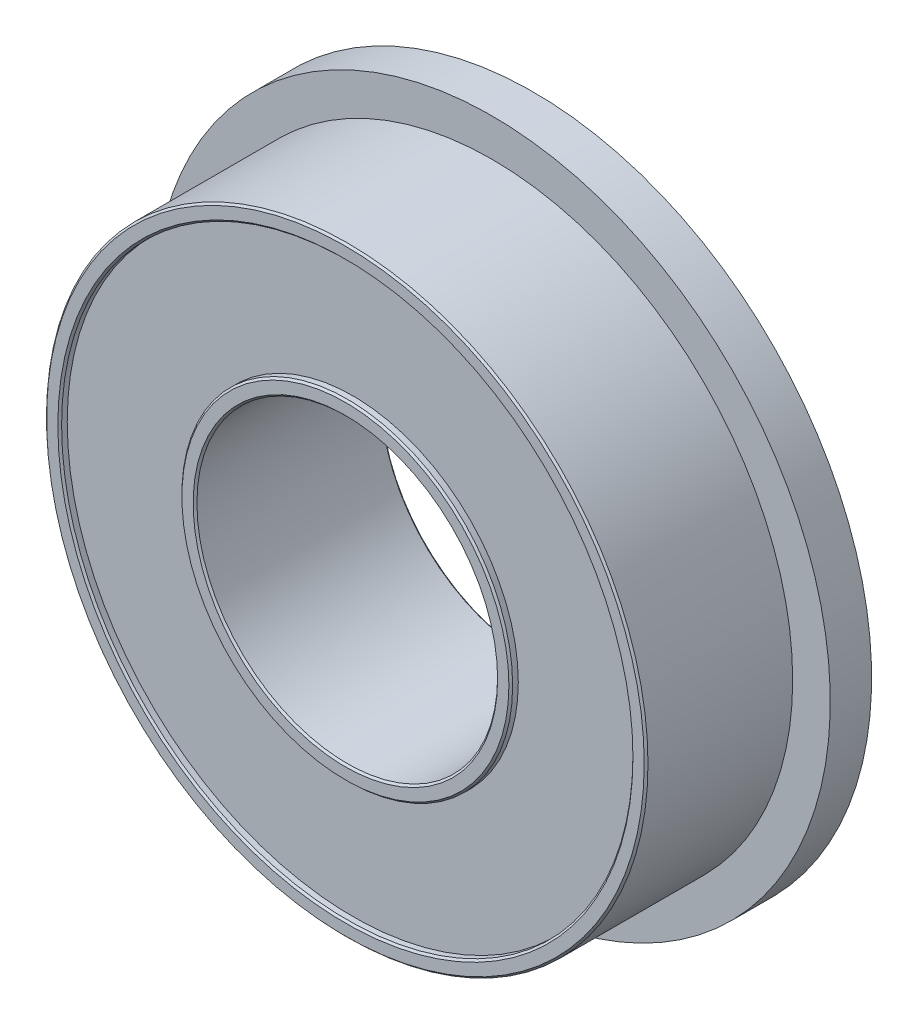
ISO-10303-21;
HEADER;
FILE_DESCRIPTION(('STEP AP214'),'2;1');
FILE_NAME('part.step','',(''),(''),'','','');
FILE_SCHEMA(('AUTOMOTIVE_DESIGN { 1 0 10303 214 1 1 1 1 }'));
ENDSEC;
DATA;
#1=APPLICATION_CONTEXT('core data for automotive mechanical design processes');
#2=APPLICATION_PROTOCOL_DEFINITION('international standard','automotive_design',2000,#1);
#3=PRODUCT_CONTEXT('',#1,'mechanical');
#4=PRODUCT('Part','Part','',(#3));
#5=PRODUCT_RELATED_PRODUCT_CATEGORY('part','',(#4));
#6=PRODUCT_DEFINITION_FORMATION('','',#4);
#7=PRODUCT_DEFINITION_CONTEXT('part definition',#1,'design');
#8=PRODUCT_DEFINITION('design','',#6,#7);
#9=PRODUCT_DEFINITION_SHAPE('','',#8);
#10=(LENGTH_UNIT() NAMED_UNIT(*) SI_UNIT(.MILLI.,.METRE.));
#11=(NAMED_UNIT(*) PLANE_ANGLE_UNIT() SI_UNIT($,.RADIAN.));
#12=(NAMED_UNIT(*) SI_UNIT($,.STERADIAN.) SOLID_ANGLE_UNIT());
#13=UNCERTAINTY_MEASURE_WITH_UNIT(LENGTH_MEASURE(1.E-05),#10,'distance_accuracy_value','');
#14=(GEOMETRIC_REPRESENTATION_CONTEXT(3) GLOBAL_UNCERTAINTY_ASSIGNED_CONTEXT((#13)) GLOBAL_UNIT_ASSIGNED_CONTEXT((#10,
#11,#12)) REPRESENTATION_CONTEXT('',''));
#15=CARTESIAN_POINT('',(0.,0.,0.));
#16=DIRECTION('',(0.,0.,1.));
#17=DIRECTION('',(1.,0.,0.));
#18=AXIS2_PLACEMENT_3D('',#15,#16,#17);
#19=CARTESIAN_POINT('',(0.,0.,-2.5));
#20=DIRECTION('',(0.,0.,1.));
#21=DIRECTION('',(1.,0.,0.));
#22=AXIS2_PLACEMENT_3D('',#19,#20,#21);
#23=PLANE('',#22);
#24=CARTESIAN_POINT('',(0.,0.,-2.5));
#25=DIRECTION('',(0.,0.,1.));
#26=DIRECTION('',(1.,0.,0.));
#27=AXIS2_PLACEMENT_3D('',#24,#25,#26);
#28=CIRCLE('',#27,7.65);
#29=CARTESIAN_POINT('',(7.65,0.,-2.5));
#30=VERTEX_POINT('',#29);
#31=EDGE_CURVE('E40',#30,#30,#28,.T.);
#32=ORIENTED_EDGE('',*,*,#31,.T.);
#33=EDGE_LOOP('',(#32));
#34=FACE_BOUND('',#33,.T.);
#35=CARTESIAN_POINT('',(0.,0.,-2.5));
#36=DIRECTION('',(0.,0.,-1.));
#37=DIRECTION('',(-1.,0.,0.));
#38=AXIS2_PLACEMENT_3D('',#35,#36,#37);
#39=CIRCLE('',#38,9.);
#40=CARTESIAN_POINT('',(-9.,0.,-2.5));
#41=VERTEX_POINT('',#40);
#42=EDGE_CURVE('E87',#41,#41,#39,.T.);
#43=ORIENTED_EDGE('',*,*,#42,.T.);
#44=EDGE_LOOP('',(#43));
#45=FACE_BOUND('',#44,.T.);
#46=ADVANCED_FACE('F33',(#34,#45),#23,.F.);
#47=CARTESIAN_POINT('',(0.,0.,2.5));
#48=DIRECTION('',(0.,0.,1.));
#49=DIRECTION('',(1.,0.,0.));
#50=AXIS2_PLACEMENT_3D('',#47,#48,#49);
#51=PLANE('',#50);
#52=CARTESIAN_POINT('',(0.,0.,2.5));
#53=DIRECTION('',(0.,0.,1.));
#54=DIRECTION('',(1.,0.,0.));
#55=AXIS2_PLACEMENT_3D('',#52,#53,#54);
#56=CIRCLE('',#55,4.35000000000001);
#57=CARTESIAN_POINT('',(4.35000000000001,0.,2.5));
#58=VERTEX_POINT('',#57);
#59=EDGE_CURVE('E62',#58,#58,#56,.T.);
#60=ORIENTED_EDGE('',*,*,#59,.T.);
#61=EDGE_LOOP('',(#60));
#62=FACE_BOUND('',#61,.T.);
#63=CARTESIAN_POINT('',(0.,0.,2.5));
#64=DIRECTION('',(0.,0.,1.));
#65=DIRECTION('',(1.,0.,0.));
#66=AXIS2_PLACEMENT_3D('',#63,#64,#65);
#67=CIRCLE('',#66,4.04999999999999);
#68=CARTESIAN_POINT('',(4.04999999999999,0.,2.5));
#69=VERTEX_POINT('',#68);
#70=EDGE_CURVE('E65',#69,#69,#67,.F.);
#71=ORIENTED_EDGE('',*,*,#70,.T.);
#72=EDGE_LOOP('',(#71));
#73=FACE_BOUND('',#72,.T.);
#74=ADVANCED_FACE('F123',(#62,#73),#51,.T.);
#75=CARTESIAN_POINT('',(0.,0.,2.5));
#76=DIRECTION('',(0.,0.,-1.));
#77=DIRECTION('',(-1.,0.,0.));
#78=AXIS2_PLACEMENT_3D('',#75,#76,#77);
#79=CYLINDRICAL_SURFACE('',#78,8.);
#80=CARTESIAN_POINT('',(0.,0.,2.45));
#81=DIRECTION('',(0.,0.,1.));
#82=DIRECTION('',(1.,0.,0.));
#83=AXIS2_PLACEMENT_3D('',#80,#81,#82);
#84=CIRCLE('',#83,8.);
#85=CARTESIAN_POINT('',(8.,0.,2.45));
#86=VERTEX_POINT('',#85);
#87=EDGE_CURVE('E48',#86,#86,#84,.F.);
#88=ORIENTED_EDGE('',*,*,#87,.T.);
#89=EDGE_LOOP('',(#88));
#90=FACE_BOUND('',#89,.T.);
#91=CARTESIAN_POINT('',(0.,0.,-1.4));
#92=DIRECTION('',(0.,0.,-1.));
#93=DIRECTION('',(-1.,0.,0.));
#94=AXIS2_PLACEMENT_3D('',#91,#92,#93);
#95=CIRCLE('',#94,8.);
#96=CARTESIAN_POINT('',(-8.,0.,-1.4));
#97=VERTEX_POINT('',#96);
#98=EDGE_CURVE('E83',#97,#97,#95,.T.);
#99=ORIENTED_EDGE('',*,*,#98,.F.);
#100=EDGE_LOOP('',(#99));
#101=FACE_BOUND('',#100,.T.);
#102=ADVANCED_FACE('F129',(#90,#101),#79,.T.);
#103=CARTESIAN_POINT('',(0.,0.,2.5));
#104=DIRECTION('',(0.,0.,1.));
#105=DIRECTION('',(1.,0.,0.));
#106=AXIS2_PLACEMENT_3D('',#103,#104,#105);
#107=CIRCLE('',#106,7.95);
#108=CARTESIAN_POINT('',(7.95,0.,2.5));
#109=VERTEX_POINT('',#108);
#110=EDGE_CURVE('E53',#109,#109,#107,.T.);
#111=ORIENTED_EDGE('',*,*,#110,.T.);
#112=EDGE_LOOP('',(#111));
#113=FACE_BOUND('',#112,.T.);
#114=CARTESIAN_POINT('',(0.,0.,2.5));
#115=DIRECTION('',(0.,0.,1.));
#116=DIRECTION('',(1.,0.,0.));
#117=AXIS2_PLACEMENT_3D('',#114,#115,#116);
#118=CIRCLE('',#117,7.65);
#119=CARTESIAN_POINT('',(7.65,0.,2.5));
#120=VERTEX_POINT('',#119);
#121=EDGE_CURVE('E56',#120,#120,#118,.F.);
#122=ORIENTED_EDGE('',*,*,#121,.T.);
#123=EDGE_LOOP('',(#122));
#124=FACE_BOUND('',#123,.T.);
#125=ADVANCED_FACE('F132',(#113,#124),#51,.T.);
#126=CARTESIAN_POINT('',(0.,0.,-2.5));
#127=DIRECTION('',(0.,0.,1.));
#128=DIRECTION('',(1.,0.,0.));
#129=AXIS2_PLACEMENT_3D('',#126,#127,#128);
#130=CIRCLE('',#129,4.05);
#131=CARTESIAN_POINT('',(4.05,0.,-2.5));
#132=VERTEX_POINT('',#131);
#133=EDGE_CURVE('E77',#132,#132,#130,.T.);
#134=ORIENTED_EDGE('',*,*,#133,.T.);
#135=EDGE_LOOP('',(#134));
#136=FACE_BOUND('',#135,.T.);
#137=CARTESIAN_POINT('',(0.,0.,-2.5));
#138=DIRECTION('',(0.,0.,1.));
#139=DIRECTION('',(1.,0.,0.));
#140=AXIS2_PLACEMENT_3D('',#137,#138,#139);
#141=CIRCLE('',#140,4.35);
#142=CARTESIAN_POINT('',(4.35,0.,-2.5));
#143=VERTEX_POINT('',#142);
#144=EDGE_CURVE('E80',#143,#143,#141,.F.);
#145=ORIENTED_EDGE('',*,*,#144,.T.);
#146=EDGE_LOOP('',(#145));
#147=FACE_BOUND('',#146,.T.);
#148=ADVANCED_FACE('F125',(#136,#147),#23,.F.);
#149=CARTESIAN_POINT('',(0.,0.,2.5));
#150=DIRECTION('',(0.,0.,-1.));
#151=DIRECTION('',(-1.,0.,0.));
#152=AXIS2_PLACEMENT_3D('',#149,#150,#151);
#153=CYLINDRICAL_SURFACE('',#152,4.);
#154=CARTESIAN_POINT('',(0.,0.,-2.45));
#155=DIRECTION('',(0.,0.,1.));
#156=DIRECTION('',(1.,0.,0.));
#157=AXIS2_PLACEMENT_3D('',#154,#155,#156);
#158=CIRCLE('',#157,4.);
#159=CARTESIAN_POINT('',(4.,0.,-2.45));
#160=VERTEX_POINT('',#159);
#161=EDGE_CURVE('E71',#160,#160,#158,.F.);
#162=ORIENTED_EDGE('',*,*,#161,.T.);
#163=EDGE_LOOP('',(#162));
#164=FACE_BOUND('',#163,.T.);
#165=CARTESIAN_POINT('',(0.,0.,2.45));
#166=DIRECTION('',(0.,0.,1.));
#167=DIRECTION('',(1.,0.,0.));
#168=AXIS2_PLACEMENT_3D('',#165,#166,#167);
#169=CIRCLE('',#168,4.);
#170=CARTESIAN_POINT('',(4.,0.,2.45));
#171=VERTEX_POINT('',#170);
#172=EDGE_CURVE('E74',#171,#171,#169,.T.);
#173=ORIENTED_EDGE('',*,*,#172,.T.);
#174=EDGE_LOOP('',(#173));
#175=FACE_BOUND('',#174,.T.);
#176=ADVANCED_FACE('F136',(#164,#175),#153,.F.);
#177=CARTESIAN_POINT('',(0.,0.,-1.4));
#178=DIRECTION('',(0.,0.,-1.));
#179=DIRECTION('',(-1.,0.,0.));
#180=AXIS2_PLACEMENT_3D('',#177,#178,#179);
#181=PLANE('',#180);
#182=CARTESIAN_POINT('',(0.,0.,-1.4));
#183=DIRECTION('',(0.,0.,-1.));
#184=DIRECTION('',(-1.,0.,0.));
#185=AXIS2_PLACEMENT_3D('',#182,#183,#184);
#186=CIRCLE('',#185,9.);
#187=CARTESIAN_POINT('',(-9.,0.,-1.4));
#188=VERTEX_POINT('',#187);
#189=EDGE_CURVE('E86',#188,#188,#186,.T.);
#190=ORIENTED_EDGE('',*,*,#189,.F.);
#191=EDGE_LOOP('',(#190));
#192=FACE_BOUND('',#191,.T.);
#193=ORIENTED_EDGE('',*,*,#98,.T.);
#194=EDGE_LOOP('',(#193));
#195=FACE_BOUND('',#194,.T.);
#196=ADVANCED_FACE('F142',(#192,#195),#181,.F.);
#197=CARTESIAN_POINT('',(0.,0.,-1.4));
#198=DIRECTION('',(0.,0.,-1.));
#199=DIRECTION('',(-1.,0.,0.));
#200=AXIS2_PLACEMENT_3D('',#197,#198,#199);
#201=CYLINDRICAL_SURFACE('',#200,9.);
#202=ORIENTED_EDGE('',*,*,#189,.T.);
#203=EDGE_LOOP('',(#202));
#204=FACE_BOUND('',#203,.T.);
#205=ORIENTED_EDGE('',*,*,#42,.F.);
#206=EDGE_LOOP('',(#205));
#207=FACE_BOUND('',#206,.T.);
#208=ADVANCED_FACE('F183',(#204,#207),#201,.T.);
#209=CARTESIAN_POINT('',(0.,0.,2.3));
#210=DIRECTION('',(0.,0.,1.));
#211=DIRECTION('',(1.,0.,0.));
#212=AXIS2_PLACEMENT_3D('',#209,#210,#211);
#213=CYLINDRICAL_SURFACE('',#212,7.6);
#214=CARTESIAN_POINT('',(0.,0.,2.44999999999999));
#215=DIRECTION('',(0.,0.,1.));
#216=DIRECTION('',(1.,0.,0.));
#217=AXIS2_PLACEMENT_3D('',#214,#215,#216);
#218=CIRCLE('',#217,7.6);
#219=CARTESIAN_POINT('',(7.6,0.,2.44999999999999));
#220=VERTEX_POINT('',#219);
#221=EDGE_CURVE('E44',#220,#220,#218,.T.);
#222=ORIENTED_EDGE('',*,*,#221,.T.);
#223=EDGE_LOOP('',(#222));
#224=FACE_BOUND('',#223,.T.);
#225=CARTESIAN_POINT('',(0.,0.,2.3));
#226=DIRECTION('',(0.,0.,1.));
#227=DIRECTION('',(1.,0.,0.));
#228=AXIS2_PLACEMENT_3D('',#225,#226,#227);
#229=CIRCLE('',#228,7.6);
#230=CARTESIAN_POINT('',(7.6,0.,2.3));
#231=VERTEX_POINT('',#230);
#232=EDGE_CURVE('E90',#231,#231,#229,.T.);
#233=ORIENTED_EDGE('',*,*,#232,.F.);
#234=EDGE_LOOP('',(#233));
#235=FACE_BOUND('',#234,.T.);
#236=ADVANCED_FACE('F179',(#224,#235),#213,.F.);
#237=CARTESIAN_POINT('',(0.,0.,2.3));
#238=DIRECTION('',(0.,0.,1.));
#239=DIRECTION('',(1.,0.,0.));
#240=AXIS2_PLACEMENT_3D('',#237,#238,#239);
#241=PLANE('',#240);
#242=CARTESIAN_POINT('',(0.,0.,2.3));
#243=DIRECTION('',(0.,0.,1.));
#244=DIRECTION('',(1.,0.,0.));
#245=AXIS2_PLACEMENT_3D('',#242,#243,#244);
#246=CIRCLE('',#245,4.4);
#247=CARTESIAN_POINT('',(4.4,0.,2.3));
#248=VERTEX_POINT('',#247);
#249=EDGE_CURVE('E95',#248,#248,#246,.T.);
#250=ORIENTED_EDGE('',*,*,#249,.F.);
#251=EDGE_LOOP('',(#250));
#252=FACE_BOUND('',#251,.T.);
#253=ORIENTED_EDGE('',*,*,#232,.T.);
#254=EDGE_LOOP('',(#253));
#255=FACE_BOUND('',#254,.T.);
#256=ADVANCED_FACE('F182',(#252,#255),#241,.T.);
#257=CARTESIAN_POINT('',(0.,0.,2.3));
#258=DIRECTION('',(0.,0.,1.));
#259=DIRECTION('',(1.,0.,0.));
#260=AXIS2_PLACEMENT_3D('',#257,#258,#259);
#261=CYLINDRICAL_SURFACE('',#260,4.4);
#262=CARTESIAN_POINT('',(0.,0.,2.45));
#263=DIRECTION('',(0.,0.,1.));
#264=DIRECTION('',(1.,0.,0.));
#265=AXIS2_PLACEMENT_3D('',#262,#263,#264);
#266=CIRCLE('',#265,4.4);
#267=CARTESIAN_POINT('',(4.4,0.,2.45));
#268=VERTEX_POINT('',#267);
#269=EDGE_CURVE('E59',#268,#268,#266,.F.);
#270=ORIENTED_EDGE('',*,*,#269,.T.);
#271=EDGE_LOOP('',(#270));
#272=FACE_BOUND('',#271,.T.);
#273=ORIENTED_EDGE('',*,*,#249,.T.);
#274=EDGE_LOOP('',(#273));
#275=FACE_BOUND('',#274,.T.);
#276=ADVANCED_FACE('F188',(#272,#275),#261,.T.);
#277=CARTESIAN_POINT('',(0.,0.,-2.3));
#278=DIRECTION('',(0.,0.,-1.));
#279=DIRECTION('',(1.,0.,0.));
#280=AXIS2_PLACEMENT_3D('',#277,#278,#279);
#281=PLANE('',#280);
#282=CARTESIAN_POINT('',(0.,0.,-2.3));
#283=DIRECTION('',(0.,0.,1.));
#284=DIRECTION('',(1.,0.,0.));
#285=AXIS2_PLACEMENT_3D('',#282,#283,#284);
#286=CIRCLE('',#285,7.6);
#287=CARTESIAN_POINT('',(7.6,0.,-2.3));
#288=VERTEX_POINT('',#287);
#289=EDGE_CURVE('E98',#288,#288,#286,.T.);
#290=ORIENTED_EDGE('',*,*,#289,.F.);
#291=EDGE_LOOP('',(#290));
#292=FACE_BOUND('',#291,.T.);
#293=CARTESIAN_POINT('',(0.,0.,-2.3));
#294=DIRECTION('',(0.,0.,1.));
#295=DIRECTION('',(1.,0.,0.));
#296=AXIS2_PLACEMENT_3D('',#293,#294,#295);
#297=CIRCLE('',#296,4.4);
#298=CARTESIAN_POINT('',(4.4,0.,-2.3));
#299=VERTEX_POINT('',#298);
#300=EDGE_CURVE('E101',#299,#299,#297,.T.);
#301=ORIENTED_EDGE('',*,*,#300,.T.);
#302=EDGE_LOOP('',(#301));
#303=FACE_BOUND('',#302,.T.);
#304=ADVANCED_FACE('F105',(#292,#303),#281,.T.);
#305=CARTESIAN_POINT('',(0.,0.,-2.3));
#306=DIRECTION('',(0.,0.,-1.));
#307=DIRECTION('',(-1.,0.,0.));
#308=AXIS2_PLACEMENT_3D('',#305,#306,#307);
#309=CYLINDRICAL_SURFACE('',#308,7.6);
#310=CARTESIAN_POINT('',(0.,0.,-2.45));
#311=DIRECTION('',(0.,0.,1.));
#312=DIRECTION('',(1.,0.,0.));
#313=AXIS2_PLACEMENT_3D('',#310,#311,#312);
#314=CIRCLE('',#313,7.6);
#315=CARTESIAN_POINT('',(7.6,0.,-2.45));
#316=VERTEX_POINT('',#315);
#317=EDGE_CURVE('E10',#316,#316,#314,.F.);
#318=ORIENTED_EDGE('',*,*,#317,.T.);
#319=EDGE_LOOP('',(#318));
#320=FACE_BOUND('',#319,.T.);
#321=ORIENTED_EDGE('',*,*,#289,.T.);
#322=EDGE_LOOP('',(#321));
#323=FACE_BOUND('',#322,.T.);
#324=ADVANCED_FACE('F110',(#320,#323),#309,.F.);
#325=CARTESIAN_POINT('',(0.,0.,-2.3));
#326=DIRECTION('',(0.,0.,-1.));
#327=DIRECTION('',(-1.,0.,0.));
#328=AXIS2_PLACEMENT_3D('',#325,#326,#327);
#329=CYLINDRICAL_SURFACE('',#328,4.4);
#330=CARTESIAN_POINT('',(0.,0.,-2.45));
#331=DIRECTION('',(0.,0.,1.));
#332=DIRECTION('',(1.,0.,0.));
#333=AXIS2_PLACEMENT_3D('',#330,#331,#332);
#334=CIRCLE('',#333,4.4);
#335=CARTESIAN_POINT('',(4.4,0.,-2.45));
#336=VERTEX_POINT('',#335);
#337=EDGE_CURVE('E68',#336,#336,#334,.T.);
#338=ORIENTED_EDGE('',*,*,#337,.T.);
#339=EDGE_LOOP('',(#338));
#340=FACE_BOUND('',#339,.T.);
#341=ORIENTED_EDGE('',*,*,#300,.F.);
#342=EDGE_LOOP('',(#341));
#343=FACE_BOUND('',#342,.T.);
#344=ADVANCED_FACE('F107',(#340,#343),#329,.T.);
#345=CARTESIAN_POINT('',(0.,0.,-2.5));
#346=DIRECTION('',(0.,0.,-1.));
#347=DIRECTION('',(-1.,0.,0.));
#348=AXIS2_PLACEMENT_3D('',#345,#346,#347);
#349=CONICAL_SURFACE('',#348,4.05,0.785398163397431);
#350=ORIENTED_EDGE('',*,*,#161,.F.);
#351=EDGE_LOOP('',(#350));
#352=FACE_BOUND('',#351,.T.);
#353=ORIENTED_EDGE('',*,*,#133,.F.);
#354=EDGE_LOOP('',(#353));
#355=FACE_BOUND('',#354,.T.);
#356=ADVANCED_FACE('F109',(#352,#355),#349,.F.);
#357=CARTESIAN_POINT('',(0.,0.,-2.45));
#358=DIRECTION('',(0.,0.,1.));
#359=DIRECTION('',(1.,0.,0.));
#360=AXIS2_PLACEMENT_3D('',#357,#358,#359);
#361=CONICAL_SURFACE('',#360,4.4,0.785398163397431);
#362=ORIENTED_EDGE('',*,*,#144,.F.);
#363=EDGE_LOOP('',(#362));
#364=FACE_BOUND('',#363,.T.);
#365=ORIENTED_EDGE('',*,*,#337,.F.);
#366=EDGE_LOOP('',(#365));
#367=FACE_BOUND('',#366,.T.);
#368=ADVANCED_FACE('F117',(#364,#367),#361,.T.);
#369=CARTESIAN_POINT('',(0.,0.,2.5));
#370=DIRECTION('',(0.,0.,-1.));
#371=DIRECTION('',(-1.,0.,0.));
#372=AXIS2_PLACEMENT_3D('',#369,#370,#371);
#373=CONICAL_SURFACE('',#372,4.35000000000001,0.785398163397422);
#374=ORIENTED_EDGE('',*,*,#269,.F.);
#375=EDGE_LOOP('',(#374));
#376=FACE_BOUND('',#375,.T.);
#377=ORIENTED_EDGE('',*,*,#59,.F.);
#378=EDGE_LOOP('',(#377));
#379=FACE_BOUND('',#378,.T.);
#380=ADVANCED_FACE('F152',(#376,#379),#373,.T.);
#381=CARTESIAN_POINT('',(0.,0.,2.45));
#382=DIRECTION('',(0.,0.,1.));
#383=DIRECTION('',(1.,0.,0.));
#384=AXIS2_PLACEMENT_3D('',#381,#382,#383);
#385=CONICAL_SURFACE('',#384,4.,0.785398163397414);
#386=ORIENTED_EDGE('',*,*,#70,.F.);
#387=EDGE_LOOP('',(#386));
#388=FACE_BOUND('',#387,.T.);
#389=ORIENTED_EDGE('',*,*,#172,.F.);
#390=EDGE_LOOP('',(#389));
#391=FACE_BOUND('',#390,.T.);
#392=ADVANCED_FACE('F158',(#388,#391),#385,.F.);
#393=CARTESIAN_POINT('',(0.,0.,2.5));
#394=DIRECTION('',(0.,0.,-1.));
#395=DIRECTION('',(-1.,0.,0.));
#396=AXIS2_PLACEMENT_3D('',#393,#394,#395);
#397=CONICAL_SURFACE('',#396,7.95,0.785398163397448);
#398=ORIENTED_EDGE('',*,*,#87,.F.);
#399=EDGE_LOOP('',(#398));
#400=FACE_BOUND('',#399,.T.);
#401=ORIENTED_EDGE('',*,*,#110,.F.);
#402=EDGE_LOOP('',(#401));
#403=FACE_BOUND('',#402,.T.);
#404=ADVANCED_FACE('F164',(#400,#403),#397,.T.);
#405=CARTESIAN_POINT('',(0.,0.,2.44999999999999));
#406=DIRECTION('',(0.,0.,1.));
#407=DIRECTION('',(1.,0.,0.));
#408=AXIS2_PLACEMENT_3D('',#405,#406,#407);
#409=CONICAL_SURFACE('',#408,7.6,0.785398163397422);
#410=CARTESIAN_POINT('',(7.65,0.,2.5));
#411=CARTESIAN_POINT('',(7.64947916666667,0.,2.49947916666667));
#412=CARTESIAN_POINT('',(7.64895833333334,0.,2.49895833333333));
#413=CARTESIAN_POINT('',(7.64791666666667,0.,2.49791666666667));
#414=CARTESIAN_POINT('',(7.64739583333334,0.,2.49739583333333));
#415=CARTESIAN_POINT('',(7.64635416666667,0.,2.49635416666667));
#416=CARTESIAN_POINT('',(7.64583333333334,0.,2.49583333333333));
#417=CARTESIAN_POINT('',(7.64479166666667,0.,2.49479166666667));
#418=CARTESIAN_POINT('',(7.64427083333334,0.,2.49427083333333));
#419=CARTESIAN_POINT('',(7.64322916666667,0.,2.49322916666667));
#420=CARTESIAN_POINT('',(7.64270833333334,0.,2.49270833333333));
#421=CARTESIAN_POINT('',(7.64166666666667,0.,2.49166666666667));
#422=CARTESIAN_POINT('',(7.64114583333334,0.,2.49114583333333));
#423=CARTESIAN_POINT('',(7.64010416666667,0.,2.49010416666667));
#424=CARTESIAN_POINT('',(7.63958333333334,0.,2.48958333333333));
#425=CARTESIAN_POINT('',(7.63854166666667,0.,2.48854166666667));
#426=CARTESIAN_POINT('',(7.63802083333334,0.,2.48802083333333));
#427=CARTESIAN_POINT('',(7.63697916666667,0.,2.48697916666667));
#428=CARTESIAN_POINT('',(7.63645833333334,0.,2.48645833333333));
#429=CARTESIAN_POINT('',(7.63541666666667,0.,2.48541666666666));
#430=CARTESIAN_POINT('',(7.63489583333334,0.,2.48489583333333));
#431=CARTESIAN_POINT('',(7.63385416666667,0.,2.48385416666666));
#432=CARTESIAN_POINT('',(7.63333333333334,0.,2.48333333333333));
#433=CARTESIAN_POINT('',(7.63229166666667,0.,2.48229166666666));
#434=CARTESIAN_POINT('',(7.63177083333334,0.,2.48177083333333));
#435=CARTESIAN_POINT('',(7.63072916666667,0.,2.48072916666666));
#436=CARTESIAN_POINT('',(7.63020833333333,0.,2.48020833333333));
#437=CARTESIAN_POINT('',(7.62916666666667,0.,2.47916666666666));
#438=CARTESIAN_POINT('',(7.62864583333334,0.,2.47864583333333));
#439=CARTESIAN_POINT('',(7.62760416666667,0.,2.47760416666666));
#440=CARTESIAN_POINT('',(7.62708333333334,0.,2.47708333333333));
#441=CARTESIAN_POINT('',(7.62604166666667,0.,2.47604166666666));
#442=CARTESIAN_POINT('',(7.62552083333333,0.,2.47552083333333));
#443=CARTESIAN_POINT('',(7.62447916666667,0.,2.47447916666666));
#444=CARTESIAN_POINT('',(7.62395833333334,0.,2.47395833333333));
#445=CARTESIAN_POINT('',(7.62291666666667,0.,2.47291666666666));
#446=CARTESIAN_POINT('',(7.62239583333333,0.,2.47239583333333));
#447=CARTESIAN_POINT('',(7.62135416666667,0.,2.47135416666666));
#448=CARTESIAN_POINT('',(7.62083333333333,0.,2.47083333333333));
#449=CARTESIAN_POINT('',(7.61979166666667,0.,2.46979166666666));
#450=CARTESIAN_POINT('',(7.61927083333333,0.,2.46927083333333));
#451=CARTESIAN_POINT('',(7.61822916666667,0.,2.46822916666666));
#452=CARTESIAN_POINT('',(7.61770833333333,0.,2.46770833333333));
#453=CARTESIAN_POINT('',(7.61666666666667,0.,2.46666666666666));
#454=CARTESIAN_POINT('',(7.61614583333333,0.,2.46614583333333));
#455=CARTESIAN_POINT('',(7.61510416666667,0.,2.46510416666666));
#456=CARTESIAN_POINT('',(7.61458333333333,0.,2.46458333333333));
#457=CARTESIAN_POINT('',(7.61354166666667,0.,2.46354166666666));
#458=CARTESIAN_POINT('',(7.61302083333333,0.,2.46302083333333));
#459=CARTESIAN_POINT('',(7.61197916666667,0.,2.46197916666666));
#460=CARTESIAN_POINT('',(7.61145833333333,0.,2.46145833333333));
#461=CARTESIAN_POINT('',(7.61041666666667,0.,2.46041666666666));
#462=CARTESIAN_POINT('',(7.60989583333333,0.,2.45989583333333));
#463=CARTESIAN_POINT('',(7.60885416666667,0.,2.45885416666666));
#464=CARTESIAN_POINT('',(7.60833333333333,0.,2.45833333333333));
#465=CARTESIAN_POINT('',(7.60729166666667,0.,2.45729166666666));
#466=CARTESIAN_POINT('',(7.60677083333333,0.,2.45677083333333));
#467=CARTESIAN_POINT('',(7.60572916666667,0.,2.45572916666666));
#468=CARTESIAN_POINT('',(7.60520833333333,0.,2.45520833333333));
#469=CARTESIAN_POINT('',(7.60416666666667,0.,2.45416666666666));
#470=CARTESIAN_POINT('',(7.60364583333333,0.,2.45364583333333));
#471=CARTESIAN_POINT('',(7.60260416666667,0.,2.45260416666666));
#472=CARTESIAN_POINT('',(7.60208333333333,0.,2.45208333333333));
#473=CARTESIAN_POINT('',(7.60104166666667,0.,2.45104166666666));
#474=CARTESIAN_POINT('',(7.60052083333333,0.,2.45052083333333));
#475=CARTESIAN_POINT('',(7.6,0.,2.44999999999999));
#476=B_SPLINE_CURVE_WITH_KNOTS('',3,(#410,#411,#412,#413,#414,#415,#416,#417,#418,#419,#420,
#421,#422,#423,#424,#425,#426,#427,#428,#429,#430,#431,#432,#433,#434,#435,#436,#437,#438,#439,
#440,#441,#442,#443,#444,#445,#446,#447,#448,#449,#450,#451,#452,#453,#454,#455,#456,#457,#458,
#459,#460,#461,#462,#463,#464,#465,#466,#467,#468,#469,#470,#471,#472,#473,#474,#475),
.UNSPECIFIED.,.F.,.F.,(4,2,2,2,2,2,2,2,2,2,2,2,2,2,2,2,2,2,2,2,2,2,2,2,2,2,2,2,2,2,2,2,4),(0.,
0.00220970869120864,0.00441941738241666,0.00662912607362469,0.00883883476483332,
0.0110485434560413,0.0132582521472494,0.015467960838458,0.0176776695296657,0.0198873782208738,
0.0220970869120824,0.0243067956032904,0.0265165042944984,0.0287262129857071,0.0309359216769151,
0.0331456303681231,0.0353553390593315,0.0375650477505395,0.0397747564417475,0.0419844651329561,
0.0441941738241642,0.0464038825153722,0.0486135912065808,0.0508232998977889,0.0530330085889975,
0.0552427172802052,0.0574524259714132,0.0596621346626219,0.0618718433538299,0.0640815520450379,
0.0662912607362466,0.0685009694274546,0.0707106781186623),.UNSPECIFIED.);
#477=EDGE_CURVE('BSEAM167',#120,#220,#476,.T.);
#478=ORIENTED_EDGE('',*,*,#121,.F.);
#479=ORIENTED_EDGE('',*,*,#221,.F.);
#480=ORIENTED_EDGE('',*,*,#477,.T.);
#481=ORIENTED_EDGE('',*,*,#477,.F.);
#482=EDGE_LOOP('',(#478,#480,#479,#481));
#483=FACE_BOUND('',#482,.T.);
#484=ADVANCED_FACE('F167',(#483),#409,.F.);
#485=CARTESIAN_POINT('',(0.,0.,-2.5));
#486=DIRECTION('',(0.,0.,-1.));
#487=DIRECTION('',(-1.,0.,0.));
#488=AXIS2_PLACEMENT_3D('',#485,#486,#487);
#489=CONICAL_SURFACE('',#488,7.65,0.785398163397431);
#490=ORIENTED_EDGE('',*,*,#317,.F.);
#491=EDGE_LOOP('',(#490));
#492=FACE_BOUND('',#491,.T.);
#493=ORIENTED_EDGE('',*,*,#31,.F.);
#494=EDGE_LOOP('',(#493));
#495=FACE_BOUND('',#494,.T.);
#496=ADVANCED_FACE('F35',(#492,#495),#489,.F.);
#497=CLOSED_SHELL('',(#46,#74,#102,#125,#148,#176,#196,#208,#236,#256,#276,#304,#324,#344,#356,
#368,#380,#392,#404,#484,#496));
#498=MANIFOLD_SOLID_BREP('B2',#497);
#499=ADVANCED_BREP_SHAPE_REPRESENTATION('',(#18,#498),#14);
#500=SHAPE_DEFINITION_REPRESENTATION(#9,#499);
ENDSEC;
END-ISO-10303-21;
